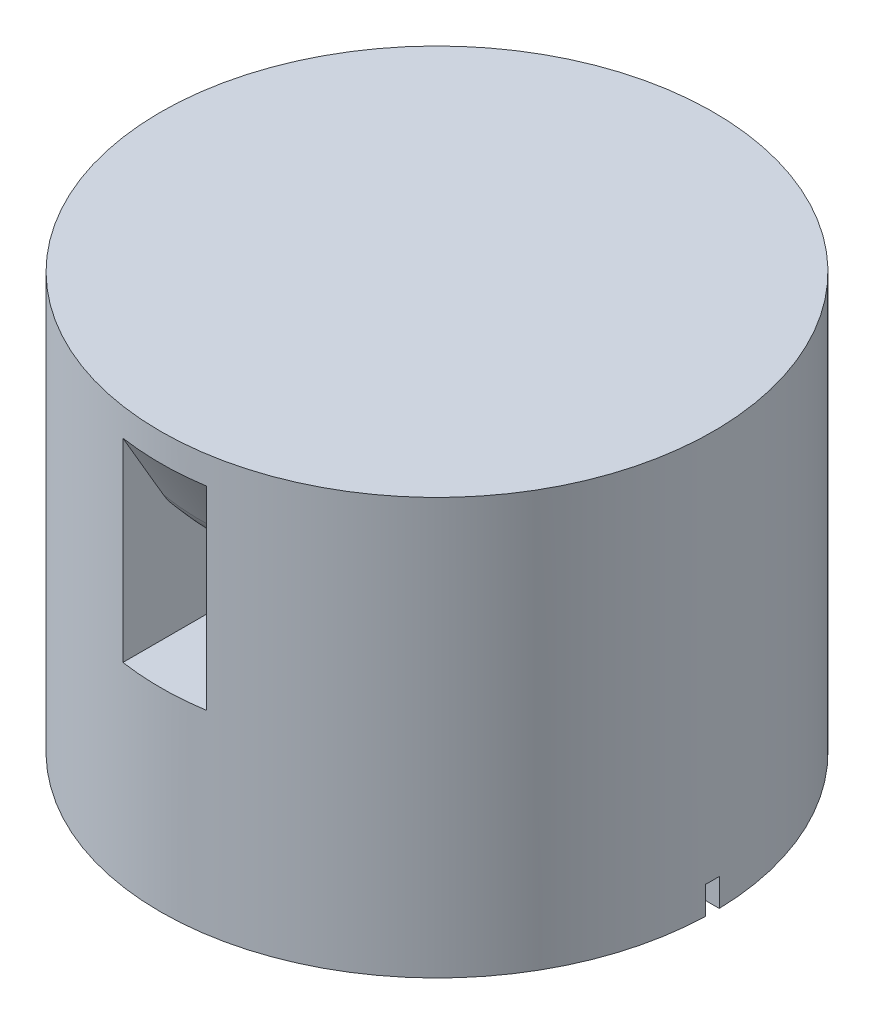
ISO-10303-21;
HEADER;
FILE_DESCRIPTION(('STEP AP214'),'2;1');
FILE_NAME('part.step','',(''),(''),'','','');
FILE_SCHEMA(('AUTOMOTIVE_DESIGN { 1 0 10303 214 1 1 1 1 }'));
ENDSEC;
DATA;
#1=APPLICATION_CONTEXT('core data for automotive mechanical design processes');
#2=APPLICATION_PROTOCOL_DEFINITION('international standard','automotive_design',2000,#1);
#3=PRODUCT_CONTEXT('',#1,'mechanical');
#4=PRODUCT('Part','Part','',(#3));
#5=PRODUCT_RELATED_PRODUCT_CATEGORY('part','',(#4));
#6=PRODUCT_DEFINITION_FORMATION('','',#4);
#7=PRODUCT_DEFINITION_CONTEXT('part definition',#1,'design');
#8=PRODUCT_DEFINITION('design','',#6,#7);
#9=PRODUCT_DEFINITION_SHAPE('','',#8);
#10=(LENGTH_UNIT() NAMED_UNIT(*) SI_UNIT(.MILLI.,.METRE.));
#11=(NAMED_UNIT(*) PLANE_ANGLE_UNIT() SI_UNIT($,.RADIAN.));
#12=(NAMED_UNIT(*) SI_UNIT($,.STERADIAN.) SOLID_ANGLE_UNIT());
#13=UNCERTAINTY_MEASURE_WITH_UNIT(LENGTH_MEASURE(1.E-05),#10,'distance_accuracy_value','');
#14=(GEOMETRIC_REPRESENTATION_CONTEXT(3) GLOBAL_UNCERTAINTY_ASSIGNED_CONTEXT((#13)) GLOBAL_UNIT_ASSIGNED_CONTEXT((#10,
#11,#12)) REPRESENTATION_CONTEXT('',''));
#15=CARTESIAN_POINT('',(0.,0.,0.));
#16=DIRECTION('',(0.,0.,1.));
#17=DIRECTION('',(1.,0.,0.));
#18=AXIS2_PLACEMENT_3D('',#15,#16,#17);
#19=CARTESIAN_POINT('',(-20.5796015309055,4.74630459649336,33.8553121090137));
#20=DIRECTION('',(0.,1.,0.));
#21=DIRECTION('',(0.,0.,1.));
#22=AXIS2_PLACEMENT_3D('',#19,#20,#21);
#23=PLANE('',#22);
#24=CARTESIAN_POINT('',(-20.5796015309055,4.74630459649336,33.8553121090137));
#25=DIRECTION('',(0.,1.,0.));
#26=DIRECTION('',(0.,0.,1.));
#27=AXIS2_PLACEMENT_3D('',#24,#25,#26);
#28=CIRCLE('',#27,6.32716035241819);
#29=CARTESIAN_POINT('',(-14.2538714380474,4.74630459649336,33.720787324972));
#30=VERTEX_POINT('',#29);
#31=CARTESIAN_POINT('',(-26.9053316237637,4.74630459649336,33.720787324972));
#32=VERTEX_POINT('',#31);
#33=EDGE_CURVE('E163',#30,#32,#28,.T.);
#34=ORIENTED_EDGE('',*,*,#33,.F.);
#35=DIRECTION('',(-1.,0.,0.));
#36=VECTOR('',#35,1.);
#37=CARTESIAN_POINT('',(-20.5796015309055,4.74630459649336,33.720787324972));
#38=LINE('',#37,#36);
#39=EDGE_CURVE('E150',#30,#32,#38,.T.);
#40=ORIENTED_EDGE('',*,*,#39,.T.);
#41=EDGE_LOOP('',(#34,#40));
#42=FACE_BOUND('',#41,.T.);
#43=ADVANCED_FACE('F44',(#42),#23,.F.);
#44=CARTESIAN_POINT('',(-20.5796015309055,14.2713045964934,33.8553121090137));
#45=DIRECTION('',(0.,-1.,0.));
#46=DIRECTION('',(0.,0.,-1.));
#47=AXIS2_PLACEMENT_3D('',#44,#45,#46);
#48=CYLINDRICAL_SURFACE('',#47,6.32716035241819);
#49=CARTESIAN_POINT('',(-20.5796015309055,5.38130459649336,33.8553121090137));
#50=DIRECTION('',(0.,-1.,0.));
#51=DIRECTION('',(0.,0.,-1.));
#52=AXIS2_PLACEMENT_3D('',#49,#50,#51);
#53=CIRCLE('',#52,6.32716035241819);
#54=CARTESIAN_POINT('',(-14.2538714380474,5.38130459649336,33.720787324972));
#55=VERTEX_POINT('',#54);
#56=CARTESIAN_POINT('',(-14.2550874629666,5.38130459649336,34.038287324972));
#57=VERTEX_POINT('',#56);
#58=EDGE_CURVE('E12',#55,#57,#53,.T.);
#59=ORIENTED_EDGE('',*,*,#58,.F.);
#60=DIRECTION('',(0.,-1.,0.));
#61=VECTOR('',#60,1.);
#62=CARTESIAN_POINT('',(-14.2538714380474,14.2713045964934,33.720787324972));
#63=LINE('',#62,#61);
#64=EDGE_CURVE('E304',#55,#30,#63,.T.);
#65=ORIENTED_EDGE('',*,*,#64,.T.);
#66=ORIENTED_EDGE('',*,*,#33,.T.);
#67=DIRECTION('',(0.,-1.,0.));
#68=VECTOR('',#67,1.);
#69=CARTESIAN_POINT('',(-26.9053316237637,14.2713045964934,33.720787324972));
#70=LINE('',#69,#68);
#71=CARTESIAN_POINT('',(-26.9053316237637,5.38130459649336,33.720787324972));
#72=VERTEX_POINT('',#71);
#73=EDGE_CURVE('E160',#32,#72,#70,.F.);
#74=ORIENTED_EDGE('',*,*,#73,.T.);
#75=CARTESIAN_POINT('',(-26.9041155988445,5.38130459649336,34.038287324972));
#76=VERTEX_POINT('',#75);
#77=EDGE_CURVE('E48',#76,#72,#53,.T.);
#78=ORIENTED_EDGE('',*,*,#77,.F.);
#79=DIRECTION('',(0.,-1.,0.));
#80=VECTOR('',#79,1.);
#81=CARTESIAN_POINT('',(-26.9041155988445,14.2713045964934,34.038287324972));
#82=LINE('',#81,#80);
#83=CARTESIAN_POINT('',(-26.9041155988445,4.74630459649336,34.038287324972));
#84=VERTEX_POINT('',#83);
#85=EDGE_CURVE('E145',#76,#84,#82,.T.);
#86=ORIENTED_EDGE('',*,*,#85,.T.);
#87=CARTESIAN_POINT('',(-14.2550874629666,4.74630459649336,34.038287324972));
#88=VERTEX_POINT('',#87);
#89=EDGE_CURVE('E158',#84,#88,#28,.T.);
#90=ORIENTED_EDGE('',*,*,#89,.T.);
#91=DIRECTION('',(0.,-1.,0.));
#92=VECTOR('',#91,1.);
#93=CARTESIAN_POINT('',(-14.2550874629666,14.2713045964934,34.038287324972));
#94=LINE('',#93,#92);
#95=EDGE_CURVE('E59',#88,#57,#94,.F.);
#96=ORIENTED_EDGE('',*,*,#95,.T.);
#97=EDGE_LOOP('',(#59,#65,#66,#74,#78,#86,#90,#96));
#98=FACE_BOUND('',#97,.T.);
#99=DIRECTION('',(0.,-1.,0.));
#100=VECTOR('',#99,1.);
#101=CARTESIAN_POINT('',(-21.5092618833237,14.2713045964934,40.113801523749));
#102=LINE('',#101,#100);
#103=CARTESIAN_POINT('',(-21.5092618833237,9.19130459649336,40.113801523749));
#104=VERTEX_POINT('',#103);
#105=CARTESIAN_POINT('',(-21.5092618833237,13.6363045964933,40.113801523749));
#106=VERTEX_POINT('',#105);
#107=EDGE_CURVE('E177',#104,#106,#102,.F.);
#108=ORIENTED_EDGE('',*,*,#107,.T.);
#109=CARTESIAN_POINT('',(-20.5796015309055,13.6363045964933,33.8553121090137));
#110=DIRECTION('',(0.,-1.,0.));
#111=DIRECTION('',(0.,0.,-1.));
#112=AXIS2_PLACEMENT_3D('',#109,#110,#111);
#113=CIRCLE('',#112,6.32716035241819);
#114=CARTESIAN_POINT('',(-19.6042618833237,13.6363045964933,40.1068455766573));
#115=VERTEX_POINT('',#114);
#116=EDGE_CURVE('E182',#106,#115,#113,.F.);
#117=ORIENTED_EDGE('',*,*,#116,.T.);
#118=DIRECTION('',(0.,-1.,0.));
#119=VECTOR('',#118,1.);
#120=CARTESIAN_POINT('',(-19.6042618833237,14.2713045964934,40.1068455766573));
#121=LINE('',#120,#119);
#122=CARTESIAN_POINT('',(-19.6042618833237,9.19130459649336,40.1068455766573));
#123=VERTEX_POINT('',#122);
#124=EDGE_CURVE('E180',#123,#115,#121,.F.);
#125=ORIENTED_EDGE('',*,*,#124,.F.);
#126=CARTESIAN_POINT('',(-20.5796015309055,9.19130459649336,33.8553121090137));
#127=DIRECTION('',(0.,-1.,0.));
#128=DIRECTION('',(0.,0.,-1.));
#129=AXIS2_PLACEMENT_3D('',#126,#127,#128);
#130=CIRCLE('',#129,6.32716035241819);
#131=EDGE_CURVE('E174',#123,#104,#130,.T.);
#132=ORIENTED_EDGE('',*,*,#131,.T.);
#133=EDGE_LOOP('',(#108,#117,#125,#132));
#134=FACE_BOUND('',#133,.T.);
#135=CARTESIAN_POINT('',(-20.5796015309055,14.2713045964934,33.8553121090137));
#136=DIRECTION('',(0.,1.,0.));
#137=DIRECTION('',(0.,0.,1.));
#138=AXIS2_PLACEMENT_3D('',#135,#136,#137);
#139=CIRCLE('',#138,6.32716035241819);
#140=CARTESIAN_POINT('',(-20.5796015309055,14.2713045964934,40.1824724614319));
#141=VERTEX_POINT('',#140);
#142=EDGE_CURVE('E167',#141,#141,#139,.T.);
#143=ORIENTED_EDGE('',*,*,#142,.F.);
#144=EDGE_LOOP('',(#143));
#145=FACE_BOUND('',#144,.T.);
#146=DIRECTION('',(0.,-1.,0.));
#147=VECTOR('',#146,1.);
#148=CARTESIAN_POINT('',(-19.6499411784874,14.2713045964934,27.5968226942784));
#149=LINE('',#148,#147);
#150=CARTESIAN_POINT('',(-19.6499411784874,9.19130459649336,27.5968226942784));
#151=VERTEX_POINT('',#150);
#152=CARTESIAN_POINT('',(-19.6499411784874,13.6363045964934,27.5968226942784));
#153=VERTEX_POINT('',#152);
#154=EDGE_CURVE('E400',#151,#153,#149,.F.);
#155=ORIENTED_EDGE('',*,*,#154,.T.);
#156=CARTESIAN_POINT('',(-20.5796015309055,13.6363045964934,33.8553121090137));
#157=DIRECTION('',(0.,-1.,0.));
#158=DIRECTION('',(0.,0.,-1.));
#159=AXIS2_PLACEMENT_3D('',#156,#157,#158);
#160=CIRCLE('',#159,6.32716035241819);
#161=CARTESIAN_POINT('',(-21.5549411784874,13.6363045964934,27.6037786413701));
#162=VERTEX_POINT('',#161);
#163=EDGE_CURVE('E403',#153,#162,#160,.F.);
#164=ORIENTED_EDGE('',*,*,#163,.T.);
#165=DIRECTION('',(0.,-1.,0.));
#166=VECTOR('',#165,1.);
#167=CARTESIAN_POINT('',(-21.5549411784874,14.2713045964934,27.6037786413701));
#168=LINE('',#167,#166);
#169=CARTESIAN_POINT('',(-21.5549411784874,9.19130459649336,27.6037786413701));
#170=VERTEX_POINT('',#169);
#171=EDGE_CURVE('E405',#170,#162,#168,.F.);
#172=ORIENTED_EDGE('',*,*,#171,.F.);
#173=CARTESIAN_POINT('',(-20.5796015309055,9.19130459649336,33.8553121090137));
#174=DIRECTION('',(0.,-1.,0.));
#175=DIRECTION('',(0.,0.,-1.));
#176=AXIS2_PLACEMENT_3D('',#173,#174,#175);
#177=CIRCLE('',#176,6.32716035241819);
#178=EDGE_CURVE('E240',#170,#151,#177,.T.);
#179=ORIENTED_EDGE('',*,*,#178,.T.);
#180=EDGE_LOOP('',(#155,#164,#172,#179));
#181=FACE_BOUND('',#180,.T.);
#182=ADVANCED_FACE('F156',(#98,#134,#145,#181),#48,.T.);
#183=CARTESIAN_POINT('',(-20.5796015309055,14.2713045964934,33.8553121090137));
#184=DIRECTION('',(0.,1.,0.));
#185=DIRECTION('',(0.,0.,1.));
#186=AXIS2_PLACEMENT_3D('',#183,#184,#185);
#187=PLANE('',#186);
#188=ORIENTED_EDGE('',*,*,#142,.T.);
#189=EDGE_LOOP('',(#188));
#190=FACE_BOUND('',#189,.T.);
#191=ADVANCED_FACE('F385',(#190),#187,.T.);
#192=ORIENTED_EDGE('',*,*,#89,.F.);
#193=DIRECTION('',(1.,0.,0.));
#194=VECTOR('',#193,1.);
#195=CARTESIAN_POINT('',(-20.5796015309055,4.74630459649336,34.038287324972));
#196=LINE('',#195,#194);
#197=EDGE_CURVE('E142',#84,#88,#196,.T.);
#198=ORIENTED_EDGE('',*,*,#197,.T.);
#199=EDGE_LOOP('',(#192,#198));
#200=FACE_BOUND('',#199,.T.);
#201=ADVANCED_FACE('F162',(#200),#23,.F.);
#202=CARTESIAN_POINT('',(-21.5092618833237,11.0963045964934,37.6424724614319));
#203=DIRECTION('',(-1.,0.,0.));
#204=DIRECTION('',(0.,0.,1.));
#205=AXIS2_PLACEMENT_3D('',#202,#203,#204);
#206=PLANE('',#205);
#207=DIRECTION('',(0.,0.,1.));
#208=VECTOR('',#207,1.);
#209=CARTESIAN_POINT('',(-21.5092618833237,9.19130459649336,37.6424724614319));
#210=LINE('',#209,#208);
#211=CARTESIAN_POINT('',(-21.5092618833237,9.19130459649336,37.6424724614319));
#212=VERTEX_POINT('',#211);
#213=EDGE_CURVE('E169',#212,#104,#210,.T.);
#214=ORIENTED_EDGE('',*,*,#213,.F.);
#215=DIRECTION('',(0.,-1.,0.));
#216=VECTOR('',#215,1.);
#217=CARTESIAN_POINT('',(-21.5092618833237,11.0963045964934,37.6424724614319));
#218=LINE('',#217,#216);
#219=CARTESIAN_POINT('',(-21.5092618833237,11.0963045964934,37.6424724614319));
#220=VERTEX_POINT('',#219);
#221=EDGE_CURVE('E325',#220,#212,#218,.T.);
#222=ORIENTED_EDGE('',*,*,#221,.F.);
#223=CARTESIAN_POINT('',(-21.7792183016791,11.0963045964934,37.6424724614319));
#224=CARTESIAN_POINT('',(-22.1096656489326,11.2055818903173,38.5355557012115));
#225=CARTESIAN_POINT('',(-22.3065995956829,12.0347020523457,38.9743169426207));
#226=CARTESIAN_POINT('',(-21.6910444135901,11.0963045964934,37.6424724614319));
#227=CARTESIAN_POINT('',(-21.9990534461454,11.1935737425758,38.5643527731439));
#228=CARTESIAN_POINT('',(-22.1793590067099,12.0385688348577,39.0196133596076));
#229=CARTESIAN_POINT('',(-21.6014394398801,11.0963045964934,37.6424724614319));
#230=CARTESIAN_POINT('',(-21.886522196192,11.1819552256428,38.5898473176062));
#231=CARTESIAN_POINT('',(-22.050204323694,12.0412441540373,39.0594610331579));
#232=CARTESIAN_POINT('',(-21.4202113763615,11.0963045964934,37.6424724614319));
#233=CARTESIAN_POINT('',(-21.6575251765942,11.1604783949205,38.6344113365675));
#234=CARTESIAN_POINT('',(-21.7891633219495,12.0450338324148,39.1284849162753));
#235=CARTESIAN_POINT('',(-21.3285900252199,11.0963045964934,37.6424724614319));
#236=CARTESIAN_POINT('',(-21.5412078754435,11.1506456276036,38.6534126681317));
#237=CARTESIAN_POINT('',(-21.6572793620387,12.0461494867324,39.1576699650134));
#238=CARTESIAN_POINT('',(-21.1434586554428,11.0963045964934,37.6424724614319));
#239=CARTESIAN_POINT('',(-21.3049440221206,11.1338176084532,38.6849700903826));
#240=CARTESIAN_POINT('',(-21.3908477528837,12.0476500752033,39.205816113611));
#241=CARTESIAN_POINT('',(-21.0499405034984,11.0963045964934,37.6424724614319));
#242=CARTESIAN_POINT('',(-21.1851866686426,11.1268695570108,38.6974254221616));
#243=CARTESIAN_POINT('',(-21.2562887328968,12.0480304894575,39.224713463007));
#244=CARTESIAN_POINT('',(-20.8621433399089,11.0963045964934,37.6424724614319));
#245=CARTESIAN_POINT('',(-20.9437979901111,11.1165952650812,38.7155977642217));
#246=CARTESIAN_POINT('',(-20.9860911935067,12.0484906136459,39.2521649277144));
#247=CARTESIAN_POINT('',(-20.7678641350637,11.0963045964934,37.6424724614319));
#248=CARTESIAN_POINT('',(-20.8224067539581,11.1132905186426,38.7212757452005));
#249=CARTESIAN_POINT('',(-20.8504524001225,12.0485702446535,39.2607163278115));
#250=CARTESIAN_POINT('',(-20.5766240164166,11.0963045964934,37.6424724614319));
#251=CARTESIAN_POINT('',(-20.5757344082746,11.1106227111804,38.7258724349378));
#252=CARTESIAN_POINT('',(-20.5753178205361,12.0486396786928,39.2676277323927));
#253=CARTESIAN_POINT('',(-20.4796582418544,11.0963045964934,37.6424724614319));
#254=CARTESIAN_POINT('',(-20.4507136155471,11.1113723589803,38.7245978359848));
#255=CARTESIAN_POINT('',(-20.4358150719852,12.0486270454861,39.2657116736717));
#256=CARTESIAN_POINT('',(-20.2861277357106,11.0963045964934,37.6424724614319));
#257=CARTESIAN_POINT('',(-20.2012868601358,11.1170004362871,38.7148438018607));
#258=CARTESIAN_POINT('',(-20.1573824855133,12.0484572168905,39.2510300401489));
#259=CARTESIAN_POINT('',(-20.1895629969601,11.0963045964934,37.6424724614319));
#260=CARTESIAN_POINT('',(-20.0771559148737,11.121866357438,38.7063861198594));
#261=CARTESIAN_POINT('',(-20.0184526373514,12.048300024097,39.2382646601359));
#262=CARTESIAN_POINT('',(-19.9978225986984,11.0963045964934,37.6424724614319));
#263=CARTESIAN_POINT('',(-19.8312875572798,11.1352031566803,38.6823538532164));
#264=CARTESIAN_POINT('',(-19.7425643050365,12.0475205735769,39.2018434516658));
#265=CARTESIAN_POINT('',(-19.9026429637207,11.0963045964934,37.6424724614319));
#266=CARTESIAN_POINT('',(-19.7097892591353,11.1436329663817,38.6668579433805));
#267=CARTESIAN_POINT('',(-19.6056002082702,12.0469001517801,39.1782307564637));
#268=CARTESIAN_POINT('',(-19.7140351733358,11.0963045964934,37.6424724614319));
#269=CARTESIAN_POINT('',(-19.4700184579071,11.1631663420208,38.6288709910321));
#270=CARTESIAN_POINT('',(-19.3340950323966,12.0445738772183,39.1199443389813));
#271=CARTESIAN_POINT('',(-19.6206065820495,11.0963045964934,37.6424724614319));
#272=CARTESIAN_POINT('',(-19.3519409897519,11.1742371811836,38.606453887727));
#273=CARTESIAN_POINT('',(-19.1995533506257,12.0428682983724,39.0852734091586));
#274=CARTESIAN_POINT('',(-19.411159264568,11.0963045964934,37.6424724614319));
#275=CARTESIAN_POINT('',(-19.0888132022642,11.2009451766221,38.547749558731));
#276=CARTESIAN_POINT('',(-18.897668805336,12.0366833953803,38.9935351005625));
#277=CARTESIAN_POINT('',(-19.2959130733997,11.0963045964934,37.6424724614319));
#278=CARTESIAN_POINT('',(-18.9450911128933,11.2169890660086,38.5094330165098));
#279=CARTESIAN_POINT('',(-18.7313648625663,12.0315754824632,38.9329403782083));
#280=CARTESIAN_POINT('',(-19.1280022690643,11.0963045964934,37.6424724614319));
#281=CARTESIAN_POINT('',(-18.7364028749111,11.2400168878399,38.4437712779382));
#282=CARTESIAN_POINT('',(-18.4883281506141,12.0191490815576,38.8276561045493));
#283=CARTESIAN_POINT('',(-19.0727686109847,11.0963045964934,37.6424724614319));
#284=CARTESIAN_POINT('',(-18.6681665308301,11.247500676293,38.4205905929404));
#285=CARTESIAN_POINT('',(-18.4082549308855,12.0142003478938,38.7900863347003));
#286=CARTESIAN_POINT('',(-18.9644164100313,11.0963045964934,37.6424724614319));
#287=CARTESIAN_POINT('',(-18.5346528989852,11.2614827664091,38.371676289448));
#288=CARTESIAN_POINT('',(-18.2507866394959,12.0021267968925,38.7100324155509));
#289=CARTESIAN_POINT('',(-18.9113011876967,11.0963045964934,37.6424724614319));
#290=CARTESIAN_POINT('',(-18.4693713378686,11.267984196171,38.345955535897));
#291=CARTESIAN_POINT('',(-18.1733957954075,11.9949987042165,38.6675409295658));
#292=CARTESIAN_POINT('',(-18.8595230297982,11.0963045964934,37.6424724614319));
#293=CARTESIAN_POINT('',(-18.4056422219152,11.2737056526786,38.3189505395719));
#294=CARTESIAN_POINT('',(-18.0976837108105,11.9864962217538,38.6225830028886));
#295=(BOUNDED_SURFACE() B_SPLINE_SURFACE(3,2,((#223,#224,#225),(#226,#227,#228),(#229,#230,
#231),(#232,#233,#234),(#235,#236,#237),(#238,#239,#240),(#241,#242,#243),(#244,#245,#246),
(#247,#248,#249),(#250,#251,#252),(#253,#254,#255),(#256,#257,#258),(#259,#260,#261),(#262,#263,
#264),(#265,#266,#267),(#268,#269,#270),(#271,#272,#273),(#274,#275,#276),(#277,#278,#279),
(#280,#281,#282),(#283,#284,#285),(#286,#287,#288),(#289,#290,#291),(#292,#293,#294)),
.UNSPECIFIED.,.F.,.F.,.F.) B_SPLINE_SURFACE_WITH_KNOTS((4,2,2,2,2,2,2,2,2,2,2,4),(3,3),(0.,
0.281563117970215,0.562892291454136,0.845945506918825,1.12907299140473,1.41970298187176,
1.71032775447867,1.99980675886128,2.28921272096391,2.65738659219709,2.84210369825749,
3.02709979003919),(0.,1.),
.UNSPECIFIED.) GEOMETRIC_REPRESENTATION_ITEM() RATIONAL_B_SPLINE_SURFACE(((1.,0.89329772510079,
1.),(1.,0.889939767838788,1.),(1.,0.886841767415508,1.),(1.,0.881305683164464,1.),(1.,
0.878867053165514,1.),(1.,0.874771163782259,1.),(1.,0.873118784377259,1.),(1.,0.870698396390802,
1.),(1.,0.869930619969067,1.),(1.,0.86931120055151,1.),(1.,0.86948437300409,1.),(1.,
0.870795378872498,1.),(1.,0.871933194969115,1.),(1.,0.875107687459945,1.),(1.,0.877140802474305,
1.),(1.,0.881993547897769,1.),(1.,0.88481297972132,1.),(1.,0.891938121342945,1.),(1.,
0.896439497702486,1.),(1.,0.903610467262528,1.),(1.,0.906075164070434,1.),(1.,0.911065752874049,
1.),(1.,0.913591731673037,1.),(1.,0.916106119327105,1.))) REPRESENTATION_ITEM('') SURFACE());
#296=CARTESIAN_POINT('',(-21.5092618833237,11.0963045964934,37.6424724614319));
#297=CARTESIAN_POINT('',(-21.5092618833237,11.1006142928998,37.6983632270615));
#298=CARTESIAN_POINT('',(-21.5092618833237,11.1072138551146,37.7540540925704));
#299=CARTESIAN_POINT('',(-21.5092618833237,11.1249975053248,37.8647076033461));
#300=CARTESIAN_POINT('',(-21.5092618833237,11.1361823504062,37.9196701268069));
#301=CARTESIAN_POINT('',(-21.5092618833237,11.1766018867574,38.0828766825527));
#302=CARTESIAN_POINT('',(-21.5092618833237,11.2127069608871,38.1895104111569));
#303=CARTESIAN_POINT('',(-21.5092618833237,11.3025994231927,38.3952204187264));
#304=CARTESIAN_POINT('',(-21.5092618833237,11.3564180101921,38.4942829804958));
#305=CARTESIAN_POINT('',(-21.5092618833237,11.4803094978598,38.6815547366382));
#306=CARTESIAN_POINT('',(-21.5092618833237,11.5503625853278,38.7697769617435));
#307=CARTESIAN_POINT('',(-21.5092618833237,11.6891603092216,38.9161612929928));
#308=CARTESIAN_POINT('',(-21.5092618833237,11.7553187470333,38.9767973590451));
#309=CARTESIAN_POINT('',(-21.5092618833237,11.8955414562874,39.0882686257307));
#310=CARTESIAN_POINT('',(-21.5092618833237,11.9696138388075,39.1390936182667));
#311=CARTESIAN_POINT('',(-21.5092618833237,12.0469819987753,39.1843945774543));
#312=B_SPLINE_CURVE_WITH_KNOTS('',3,(#296,#297,#298,#299,#300,#301,#302,#303,#304,#305,#306,
#307,#308,#309,#310,#311),.UNSPECIFIED.,.F.,.F.,(4,2,2,2,2,2,2,4),(0.,0.168074204249762,
0.336176170776162,0.672169998943412,1.00875880876284,1.34493897622601,1.61330971868368,
1.88195820449471),.UNSPECIFIED.);
#313=CARTESIAN_POINT('',(-21.5092618833237,12.0469819987753,39.1843945774543));
#314=VERTEX_POINT('',#313);
#315=EDGE_CURVE('E356',#220,#314,#312,.T.);
#316=ORIENTED_EDGE('',*,*,#315,.T.);
#317=CARTESIAN_POINT('',(-21.5092618833237,11.0963045964934,38.6262706506174));
#318=CARTESIAN_POINT('',(-21.5092618833237,11.3077357914957,38.7506332767424));
#319=CARTESIAN_POINT('',(-21.5092618833237,11.5192418765568,38.8748684707272));
#320=CARTESIAN_POINT('',(-21.5092618833237,11.9423786269782,39.1231262027246));
#321=CARTESIAN_POINT('',(-21.5092618833237,12.1540092922524,39.2471487408839));
#322=CARTESIAN_POINT('',(-21.5092618833237,12.5773702426909,39.4950235103418));
#323=CARTESIAN_POINT('',(-21.5092618833237,12.7891005278305,39.6188757416825));
#324=CARTESIAN_POINT('',(-21.5092618833237,13.2126443254902,39.866438155348));
#325=CARTESIAN_POINT('',(-21.5092618833237,13.4244578380675,39.9901483375751));
#326=CARTESIAN_POINT('',(-21.5092618833237,13.6363045964933,40.113801523749));
#327=B_SPLINE_CURVE_WITH_KNOTS('',3,(#317,#318,#319,#320,#321,#322,#323,#324,#325,#326),
.UNSPECIFIED.,.F.,.F.,(4,2,2,2,4),(0.,0.735882282467495,1.47176405722892,2.20764564981234,
2.94352774781471),.UNSPECIFIED.);
#328=EDGE_CURVE('E185',#314,#106,#327,.T.);
#329=ORIENTED_EDGE('',*,*,#328,.T.);
#330=ORIENTED_EDGE('',*,*,#107,.F.);
#331=EDGE_LOOP('',(#214,#222,#316,#329,#330));
#332=FACE_BOUND('',#331,.T.);
#333=ADVANCED_FACE('F200',(#332),#206,.F.);
#334=CARTESIAN_POINT('',(-19.6042618833237,11.0963045964934,37.6424724614319));
#335=DIRECTION('',(-1.,0.,0.));
#336=DIRECTION('',(0.,0.,1.));
#337=AXIS2_PLACEMENT_3D('',#334,#335,#336);
#338=PLANE('',#337);
#339=ORIENTED_EDGE('',*,*,#124,.T.);
#340=CARTESIAN_POINT('',(-19.6042618833237,13.6363045964933,40.1068455766573));
#341=CARTESIAN_POINT('',(-19.6042618833237,13.4244387470204,39.9830435011454));
#342=CARTESIAN_POINT('',(-19.6042618833237,13.2126096324273,39.8591785136663));
#343=CARTESIAN_POINT('',(-19.6042618833237,12.7890434428268,39.6112916860172));
#344=CARTESIAN_POINT('',(-19.6042618833237,12.5773063677423,39.4872698459788));
#345=CARTESIAN_POINT('',(-19.6042618833237,12.1539424077337,39.2390380394817));
#346=CARTESIAN_POINT('',(-19.6042618833237,11.9423155228429,39.1148280729662));
#347=CARTESIAN_POINT('',(-19.6042618833237,11.5191996435106,38.8661731150644));
#348=CARTESIAN_POINT('',(-19.6042618833237,11.3077106491853,38.7417281234803));
#349=CARTESIAN_POINT('',(-19.6042618833237,11.0963045964934,38.617142255965));
#350=B_SPLINE_CURVE_WITH_KNOTS('',3,(#340,#341,#342,#343,#344,#345,#346,#347,#348,#349),
.UNSPECIFIED.,.F.,.F.,(4,2,2,2,4),(0.,0.736156818349456,1.47231301961745,2.20846944344556,
2.94462648716325),.UNSPECIFIED.);
#351=CARTESIAN_POINT('',(-19.6042618833237,12.0467177262526,39.1760686494312));
#352=VERTEX_POINT('',#351);
#353=EDGE_CURVE('E193',#115,#352,#350,.T.);
#354=ORIENTED_EDGE('',*,*,#353,.T.);
#355=CARTESIAN_POINT('',(-19.6042618833237,12.0467177262526,39.1760686494312));
#356=CARTESIAN_POINT('',(-19.6042618833237,12.0002021353895,39.1487648485426));
#357=CARTESIAN_POINT('',(-19.6042618833237,11.9548761716458,39.1194877728033));
#358=CARTESIAN_POINT('',(-19.6042618833237,11.8668777821475,39.0571971917487));
#359=CARTESIAN_POINT('',(-19.6042618833237,11.8242050000177,39.0241841899301));
#360=CARTESIAN_POINT('',(-19.6042618833237,11.7008541859556,38.9200932985967));
#361=CARTESIAN_POINT('',(-19.6042618833237,11.6245072573757,38.8437652140681));
#362=CARTESIAN_POINT('',(-19.6042618833237,11.4856150807317,38.6794832984551));
#363=CARTESIAN_POINT('',(-19.6042618833237,11.4230742157968,38.5915257894078));
#364=CARTESIAN_POINT('',(-19.6042618833237,11.3132719844937,38.4064796708043));
#365=CARTESIAN_POINT('',(-19.6042618833237,11.2660186256031,38.3093863102167));
#366=CARTESIAN_POINT('',(-19.6042618833237,11.191601503778,38.1184473172889));
#367=CARTESIAN_POINT('',(-19.6042618833237,11.1629475092236,38.0251806986278));
#368=CARTESIAN_POINT('',(-19.6042618833237,11.1302529255774,37.8830234943712));
#369=CARTESIAN_POINT('',(-19.6042618833237,11.1210692378785,37.835262823098));
#370=CARTESIAN_POINT('',(-19.6042618833237,11.1061231336941,37.7392109741832));
#371=CARTESIAN_POINT('',(-19.6042618833237,11.1003605535692,37.6909198220282));
#372=CARTESIAN_POINT('',(-19.6042618833237,11.0963045964934,37.6424724614319));
#373=B_SPLINE_CURVE_WITH_KNOTS('',3,(#355,#356,#357,#358,#359,#360,#361,#362,#363,#364,#365,
#366,#367,#368,#369,#370,#371,#372),.UNSPECIFIED.,.F.,.F.,(4,2,2,2,2,2,2,2,4),(0.,
0.161708880496266,0.323395993127052,0.645613715189041,0.967933587816608,1.29042201678779,
1.58203584268701,1.72783514402635,1.87362747089805),.UNSPECIFIED.);
#374=CARTESIAN_POINT('',(-19.6042618833237,11.0963045964934,37.6424724614319));
#375=VERTEX_POINT('',#374);
#376=EDGE_CURVE('E358',#352,#375,#373,.T.);
#377=ORIENTED_EDGE('',*,*,#376,.T.);
#378=DIRECTION('',(0.,-1.,0.));
#379=VECTOR('',#378,1.);
#380=CARTESIAN_POINT('',(-19.6042618833237,11.0963045964934,37.6424724614319));
#381=LINE('',#380,#379);
#382=CARTESIAN_POINT('',(-19.6042618833237,9.19130459649336,37.6424724614319));
#383=VERTEX_POINT('',#382);
#384=EDGE_CURVE('E333',#375,#383,#381,.T.);
#385=ORIENTED_EDGE('',*,*,#384,.T.);
#386=DIRECTION('',(0.,0.,1.));
#387=VECTOR('',#386,1.);
#388=CARTESIAN_POINT('',(-19.6042618833237,9.19130459649336,37.6424724614319));
#389=LINE('',#388,#387);
#390=EDGE_CURVE('E164',#383,#123,#389,.T.);
#391=ORIENTED_EDGE('',*,*,#390,.T.);
#392=EDGE_LOOP('',(#339,#354,#377,#385,#391));
#393=FACE_BOUND('',#392,.T.);
#394=ADVANCED_FACE('F351',(#393),#338,.T.);
#395=CARTESIAN_POINT('',(-21.5092618833237,9.19130459649336,37.6424724614319));
#396=DIRECTION('',(0.,-1.,0.));
#397=DIRECTION('',(0.,0.,-1.));
#398=AXIS2_PLACEMENT_3D('',#395,#396,#397);
#399=PLANE('',#398);
#400=ORIENTED_EDGE('',*,*,#390,.F.);
#401=DIRECTION('',(1.,0.,0.));
#402=VECTOR('',#401,1.);
#403=CARTESIAN_POINT('',(-21.5092618833237,9.19130459649336,37.6424724614319));
#404=LINE('',#403,#402);
#405=EDGE_CURVE('E330',#212,#383,#404,.T.);
#406=ORIENTED_EDGE('',*,*,#405,.F.);
#407=ORIENTED_EDGE('',*,*,#213,.T.);
#408=ORIENTED_EDGE('',*,*,#131,.F.);
#409=EDGE_LOOP('',(#400,#406,#407,#408));
#410=FACE_BOUND('',#409,.T.);
#411=ADVANCED_FACE('F341',(#410),#399,.F.);
#412=CARTESIAN_POINT('',(-10.2898007654528,4.74630459649336,37.6424724614319));
#413=DIRECTION('',(0.,0.,1.));
#414=DIRECTION('',(1.,0.,0.));
#415=AXIS2_PLACEMENT_3D('',#412,#413,#414);
#416=PLANE('',#415);
#417=ORIENTED_EDGE('',*,*,#221,.T.);
#418=ORIENTED_EDGE('',*,*,#405,.T.);
#419=ORIENTED_EDGE('',*,*,#384,.F.);
#420=DIRECTION('',(1.,0.,0.));
#421=VECTOR('',#420,1.);
#422=CARTESIAN_POINT('',(-21.5092618833237,11.0963045964934,37.6424724614319));
#423=LINE('',#422,#421);
#424=EDGE_CURVE('E335',#220,#375,#423,.T.);
#425=ORIENTED_EDGE('',*,*,#424,.F.);
#426=EDGE_LOOP('',(#417,#418,#419,#425));
#427=FACE_BOUND('',#426,.T.);
#428=ADVANCED_FACE('F210',(#427),#416,.T.);
#429=CARTESIAN_POINT('',(-20.5796015309055,11.0963045964934,33.8553121090137));
#430=DIRECTION('',(0.,1.,0.));
#431=DIRECTION('',(0.,0.,1.));
#432=AXIS2_PLACEMENT_3D('',#429,#430,#431);
#433=CONICAL_SURFACE('',#432,4.86069066867656,0.523598775598297);
#434=ORIENTED_EDGE('',*,*,#328,.F.);
#435=CARTESIAN_POINT('',(-22.3065995956829,12.0347020523457,38.9743169426207));
#436=CARTESIAN_POINT('',(-22.1793590067099,12.0385688348577,39.0196133596076));
#437=CARTESIAN_POINT('',(-22.050204323694,12.0412441540373,39.0594610331579));
#438=CARTESIAN_POINT('',(-21.7891633219495,12.0450338324148,39.1284849162753));
#439=CARTESIAN_POINT('',(-21.6572793620387,12.0461494867324,39.1576699650134));
#440=CARTESIAN_POINT('',(-21.3908477528837,12.0476500752033,39.205816113611));
#441=CARTESIAN_POINT('',(-21.2562887328968,12.0480304894575,39.224713463007));
#442=CARTESIAN_POINT('',(-20.9860911935067,12.0484906136459,39.2521649277144));
#443=CARTESIAN_POINT('',(-20.8504524001225,12.0485702446535,39.2607163278115));
#444=CARTESIAN_POINT('',(-20.5753178205361,12.0486396786928,39.2676277323927));
#445=CARTESIAN_POINT('',(-20.4358150719852,12.0486270454861,39.2657116736717));
#446=CARTESIAN_POINT('',(-20.1573824855133,12.0484572168905,39.2510300401489));
#447=CARTESIAN_POINT('',(-20.0184526373514,12.048300024097,39.2382646601359));
#448=CARTESIAN_POINT('',(-19.7425643050365,12.0475205735769,39.2018434516658));
#449=CARTESIAN_POINT('',(-19.6056002082702,12.0469001517801,39.1782307564637));
#450=CARTESIAN_POINT('',(-19.3340950323966,12.0445738772183,39.1199443389813));
#451=CARTESIAN_POINT('',(-19.1995533506257,12.0428682983724,39.0852734091586));
#452=CARTESIAN_POINT('',(-18.897668805336,12.0366833953803,38.9935351005625));
#453=CARTESIAN_POINT('',(-18.7313648625663,12.0315754824632,38.9329403782083));
#454=CARTESIAN_POINT('',(-18.4883281506141,12.0191490815576,38.8276561045493));
#455=CARTESIAN_POINT('',(-18.4082549308855,12.0142003478938,38.7900863347004));
#456=CARTESIAN_POINT('',(-18.2507866394959,12.0021267968925,38.7100324155509));
#457=CARTESIAN_POINT('',(-18.1733957954075,11.9949987042165,38.6675409295658));
#458=CARTESIAN_POINT('',(-18.0976837108105,11.9864962217538,38.6225830028886));
#459=B_SPLINE_CURVE_WITH_KNOTS('',3,(#435,#436,#437,#438,#439,#440,#441,#442,#443,#444,#445,
#446,#447,#448,#449,#450,#451,#452,#453,#454,#455,#456,#457,#458),.UNSPECIFIED.,.F.,.F.,(4,2,2,
2,2,2,2,2,2,2,2,4),(0.,0.281563117970215,0.562892291454136,0.845945506918825,1.12907299140473,
1.41970298187176,1.71032775447867,1.99980675886128,2.28921272096391,2.65738659219709,
2.84210369825749,3.02709979003919),.UNSPECIFIED.);
#460=EDGE_CURVE('E359',#314,#352,#459,.T.);
#461=ORIENTED_EDGE('',*,*,#460,.T.);
#462=ORIENTED_EDGE('',*,*,#353,.F.);
#463=ORIENTED_EDGE('',*,*,#116,.F.);
#464=EDGE_LOOP('',(#434,#461,#462,#463));
#465=FACE_BOUND('',#464,.T.);
#466=ADVANCED_FACE('F204',(#465),#433,.T.);
#467=ORIENTED_EDGE('',*,*,#376,.F.);
#468=ORIENTED_EDGE('',*,*,#460,.F.);
#469=ORIENTED_EDGE('',*,*,#315,.F.);
#470=ORIENTED_EDGE('',*,*,#424,.T.);
#471=EDGE_LOOP('',(#467,#468,#469,#470));
#472=FACE_BOUND('',#471,.T.);
#473=ADVANCED_FACE('F209',(#472),#295,.T.);
#474=CARTESIAN_POINT('',(-19.6499411784874,11.0963045964934,30.0681517565955));
#475=DIRECTION('',(1.,0.,0.));
#476=DIRECTION('',(0.,0.,-1.));
#477=AXIS2_PLACEMENT_3D('',#474,#475,#476);
#478=PLANE('',#477);
#479=DIRECTION('',(0.,0.,-1.));
#480=VECTOR('',#479,1.);
#481=CARTESIAN_POINT('',(-19.6499411784874,9.19130459649336,30.0681517565955));
#482=LINE('',#481,#480);
#483=CARTESIAN_POINT('',(-19.6499411784874,9.19130459649336,30.0681517565955));
#484=VERTEX_POINT('',#483);
#485=EDGE_CURVE('E321',#484,#151,#482,.T.);
#486=ORIENTED_EDGE('',*,*,#485,.F.);
#487=DIRECTION('',(0.,-1.,0.));
#488=VECTOR('',#487,1.);
#489=CARTESIAN_POINT('',(-19.6499411784874,11.0963045964934,30.0681517565955));
#490=LINE('',#489,#488);
#491=CARTESIAN_POINT('',(-19.6499411784874,11.0963045964934,30.0681517565955));
#492=VERTEX_POINT('',#491);
#493=EDGE_CURVE('E307',#492,#484,#490,.T.);
#494=ORIENTED_EDGE('',*,*,#493,.F.);
#495=CARTESIAN_POINT('',(-19.379984760132,11.0963045964934,30.0681517565955));
#496=CARTESIAN_POINT('',(-19.0495374128785,11.2055818903173,29.175068516816));
#497=CARTESIAN_POINT('',(-18.8526034661282,12.0347020523457,28.7363072754068));
#498=CARTESIAN_POINT('',(-19.468158648221,11.0963045964934,30.0681517565955));
#499=CARTESIAN_POINT('',(-19.1601496156657,11.1935737425758,29.1462714448835));
#500=CARTESIAN_POINT('',(-18.9798440551012,12.0385688348577,28.6910108584199));
#501=CARTESIAN_POINT('',(-19.557763621931,11.0963045964934,30.0681517565955));
#502=CARTESIAN_POINT('',(-19.2726808656192,11.1819552256428,29.1207769004213));
#503=CARTESIAN_POINT('',(-19.1089987381171,12.0412441540373,28.6511631848695));
#504=CARTESIAN_POINT('',(-19.7389916854496,11.0963045964934,30.0681517565955));
#505=CARTESIAN_POINT('',(-19.5016778852169,11.1604783949205,29.0762128814599));
#506=CARTESIAN_POINT('',(-19.3700397398616,12.0450338324148,28.5821393017522));
#507=CARTESIAN_POINT('',(-19.8306130365912,11.0963045964934,30.0681517565955));
#508=CARTESIAN_POINT('',(-19.6179951863676,11.1506456276036,29.0572115498958));
#509=CARTESIAN_POINT('',(-19.5019236997724,12.0461494867324,28.552954253014));
#510=CARTESIAN_POINT('',(-20.0157444063683,11.0963045964934,30.0681517565955));
#511=CARTESIAN_POINT('',(-19.8542590396905,11.1338176084532,29.0256541276449));
#512=CARTESIAN_POINT('',(-19.7683553089274,12.0476500752033,28.5048081044164));
#513=CARTESIAN_POINT('',(-20.1092625583127,11.0963045964934,30.0681517565955));
#514=CARTESIAN_POINT('',(-19.9740163931685,11.1268695570109,29.0131987958659));
#515=CARTESIAN_POINT('',(-19.9029143289143,12.0480304894575,28.4859107550205));
#516=CARTESIAN_POINT('',(-20.2970597219022,11.0963045964934,30.0681517565955));
#517=CARTESIAN_POINT('',(-20.2154050717,11.1165952650812,28.9950264538058));
#518=CARTESIAN_POINT('',(-20.1731118683044,12.0484906136459,28.4584592903131));
#519=CARTESIAN_POINT('',(-20.3913389267473,11.0963045964934,30.0681517565955));
#520=CARTESIAN_POINT('',(-20.336796307853,11.1132905186426,28.9893484728269));
#521=CARTESIAN_POINT('',(-20.3087506616886,12.0485702446535,28.4499078902159));
#522=CARTESIAN_POINT('',(-20.5825790453945,11.0963045964934,30.0681517565955));
#523=CARTESIAN_POINT('',(-20.5834686535365,11.1106227111804,28.9847517830896));
#524=CARTESIAN_POINT('',(-20.583885241275,12.0486396786928,28.4429964856347));
#525=CARTESIAN_POINT('',(-20.6795448199567,11.0963045964934,30.0681517565955));
#526=CARTESIAN_POINT('',(-20.7084894462639,11.1113723589803,28.9860263820427));
#527=CARTESIAN_POINT('',(-20.7233879898258,12.0486270454861,28.4449125443558));
#528=CARTESIAN_POINT('',(-20.8730753261005,11.0963045964934,30.0681517565955));
#529=CARTESIAN_POINT('',(-20.9579162016753,11.1170004362871,28.9957804161668));
#530=CARTESIAN_POINT('',(-21.0018205762978,12.0484572168905,28.4595941778785));
#531=CARTESIAN_POINT('',(-20.969640064851,11.0963045964934,30.0681517565955));
#532=CARTESIAN_POINT('',(-21.0820471469373,11.121866357438,29.004238098168));
#533=CARTESIAN_POINT('',(-21.1407504244597,12.048300024097,28.4723595578915));
#534=CARTESIAN_POINT('',(-21.1613804631127,11.0963045964934,30.0681517565955));
#535=CARTESIAN_POINT('',(-21.3279155045313,11.1352031566803,29.028270364811));
#536=CARTESIAN_POINT('',(-21.4166387567746,12.0475205735769,28.5087807663616));
#537=CARTESIAN_POINT('',(-21.2565600980904,11.0963045964934,30.0681517565955));
#538=CARTESIAN_POINT('',(-21.4494138026758,11.1436329663817,29.043766274647));
#539=CARTESIAN_POINT('',(-21.5536028535409,12.0469001517801,28.5323934615637));
#540=CARTESIAN_POINT('',(-21.4451678884753,11.0963045964934,30.0681517565955));
#541=CARTESIAN_POINT('',(-21.689184603904,11.1631663420208,29.0817532269954));
#542=CARTESIAN_POINT('',(-21.8251080294145,12.0445738772183,28.5906798790461));
#543=CARTESIAN_POINT('',(-21.5385964797616,11.0963045964934,30.0681517565955));
#544=CARTESIAN_POINT('',(-21.8072620720592,11.1742371811836,29.1041703303004));
#545=CARTESIAN_POINT('',(-21.9596497111854,12.0428682983724,28.6253508088689));
#546=CARTESIAN_POINT('',(-21.7480437972431,11.0963045964934,30.0681517565955));
#547=CARTESIAN_POINT('',(-22.0703898595469,11.2009451766221,29.1628746592964));
#548=CARTESIAN_POINT('',(-22.2615342564751,12.0366833953803,28.7170891174649));
#549=CARTESIAN_POINT('',(-21.8632899884114,11.0963045964934,30.0681517565955));
#550=CARTESIAN_POINT('',(-22.2141119489177,11.2169890660086,29.2011912015177));
#551=CARTESIAN_POINT('',(-22.4278381992447,12.0315754824632,28.7776838398192));
#552=CARTESIAN_POINT('',(-22.0312007927468,11.0963045964934,30.0681517565955));
#553=CARTESIAN_POINT('',(-22.4228001869,11.2400168878399,29.2668529400892));
#554=CARTESIAN_POINT('',(-22.670874911197,12.0191490815576,28.8829681134781));
#555=CARTESIAN_POINT('',(-22.0864344508264,11.0963045964934,30.0681517565955));
#556=CARTESIAN_POINT('',(-22.491036530981,11.247500676293,29.2900336250871));
#557=CARTESIAN_POINT('',(-22.7509481309255,12.0142003478938,28.9205378833271));
#558=CARTESIAN_POINT('',(-22.1947866517797,11.0963045964934,30.0681517565955));
#559=CARTESIAN_POINT('',(-22.6245501628259,11.2614827664092,29.3389479285795));
#560=CARTESIAN_POINT('',(-22.9084164223152,12.0021267968925,29.0005918024765));
#561=CARTESIAN_POINT('',(-22.2479018741144,11.0963045964934,30.0681517565955));
#562=CARTESIAN_POINT('',(-22.6898317239425,11.267984196171,29.3646686821304));
#563=CARTESIAN_POINT('',(-22.9858072664036,11.9949987042165,29.0430832884617));
#564=CARTESIAN_POINT('',(-22.2996800320129,11.0963045964934,30.0681517565955));
#565=CARTESIAN_POINT('',(-22.7535608398959,11.2737056526786,29.3916736784555));
#566=CARTESIAN_POINT('',(-23.0615193510006,11.9864962217538,29.0880412151388));
#567=(BOUNDED_SURFACE() B_SPLINE_SURFACE(3,2,((#495,#496,#497),(#498,#499,#500),(#501,#502,
#503),(#504,#505,#506),(#507,#508,#509),(#510,#511,#512),(#513,#514,#515),(#516,#517,#518),
(#519,#520,#521),(#522,#523,#524),(#525,#526,#527),(#528,#529,#530),(#531,#532,#533),(#534,#535,
#536),(#537,#538,#539),(#540,#541,#542),(#543,#544,#545),(#546,#547,#548),(#549,#550,#551),
(#552,#553,#554),(#555,#556,#557),(#558,#559,#560),(#561,#562,#563),(#564,#565,#566)),
.UNSPECIFIED.,.F.,.F.,.F.) B_SPLINE_SURFACE_WITH_KNOTS((4,2,2,2,2,2,2,2,2,2,2,4),(3,3),(0.,
0.281563117970215,0.562892291454139,0.845945506918825,1.12907299140473,1.41970298187175,
1.71032775447865,1.99980675886127,2.2892127209639,2.65738659219707,2.84210369825747,
3.02709979003917),(0.,1.),
.UNSPECIFIED.) GEOMETRIC_REPRESENTATION_ITEM() RATIONAL_B_SPLINE_SURFACE(((1.,0.893297725100791,
1.),(1.,0.88993976783879,1.),(1.,0.88684176741551,1.),(1.,0.881305683164467,1.),(1.,
0.878867053165518,1.),(1.,0.874771163782262,1.),(1.,0.873118784377261,1.),(1.,0.870698396390803,
1.),(1.,0.869930619969068,1.),(1.,0.869311200551511,1.),(1.,0.869484373004092,1.),(1.,
0.8707953788725,1.),(1.,0.871933194969117,1.),(1.,0.875107687459948,1.),(1.,0.877140802474307,
1.),(1.,0.881993547897771,1.),(1.,0.884812979721321,1.),(1.,0.891938121342946,1.),(1.,
0.896439497702487,1.),(1.,0.903610467262529,1.),(1.,0.906075164070436,1.),(1.,0.911065752874051,
1.),(1.,0.913591731673038,1.),(1.,0.916106119327106,1.))) REPRESENTATION_ITEM('') SURFACE());
#568=CARTESIAN_POINT('',(-19.6499411784874,11.0963045964934,30.0681517565955));
#569=CARTESIAN_POINT('',(-19.6499411784874,11.1006142929004,30.0122609909671));
#570=CARTESIAN_POINT('',(-19.6499411784874,11.1072138551149,29.9565701254591));
#571=CARTESIAN_POINT('',(-19.6499411784874,11.1249975053237,29.8459166146855));
#572=CARTESIAN_POINT('',(-19.6499411784874,11.1361823504039,29.7909540912259));
#573=CARTESIAN_POINT('',(-19.6499411784874,11.1766018867543,29.6277475354789));
#574=CARTESIAN_POINT('',(-19.6499411784874,11.2127069608862,29.5211138068729));
#575=CARTESIAN_POINT('',(-19.6499411784874,11.3025994231921,29.315403799302));
#576=CARTESIAN_POINT('',(-19.6499411784874,11.3564180101891,29.2163412375329));
#577=CARTESIAN_POINT('',(-19.6499411784874,11.4803094978559,29.0290694813899));
#578=CARTESIAN_POINT('',(-19.6499411784874,11.5503625853258,28.940847256284));
#579=CARTESIAN_POINT('',(-19.6499411784874,11.6891603092229,28.7944629250349));
#580=CARTESIAN_POINT('',(-19.6499411784874,11.7553187470359,28.7338268589831));
#581=CARTESIAN_POINT('',(-19.6499411784874,11.8955414562905,28.6223555922982));
#582=CARTESIAN_POINT('',(-19.6499411784874,11.9696138388096,28.5715305997623));
#583=CARTESIAN_POINT('',(-19.6499411784874,12.0469819987753,28.5262296405731));
#584=B_SPLINE_CURVE_WITH_KNOTS('',3,(#568,#569,#570,#571,#572,#573,#574,#575,#576,#577,#578,
#579,#580,#581,#582,#583),.UNSPECIFIED.,.F.,.F.,(4,2,2,2,2,2,2,4),(0.,0.168074204246818,
0.336176170768977,0.672169998943552,1.00875880875914,1.34493897622657,1.61330971868631,
1.88195820449488),.UNSPECIFIED.);
#585=CARTESIAN_POINT('',(-19.6499411784874,12.0469819987753,28.5262296405732));
#586=VERTEX_POINT('',#585);
#587=EDGE_CURVE('E67',#492,#586,#584,.T.);
#588=ORIENTED_EDGE('',*,*,#587,.T.);
#589=CARTESIAN_POINT('',(-19.6499411784874,11.0963045964934,29.08435356741));
#590=CARTESIAN_POINT('',(-19.6499411784874,11.3077357914957,28.9599909412851));
#591=CARTESIAN_POINT('',(-19.6499411784874,11.5192418765568,28.8357557473002));
#592=CARTESIAN_POINT('',(-19.6499411784874,11.9423786269782,28.5874980153028));
#593=CARTESIAN_POINT('',(-19.6499411784874,12.1540092922524,28.4634754771435));
#594=CARTESIAN_POINT('',(-19.6499411784874,12.5773702426909,28.2156007076857));
#595=CARTESIAN_POINT('',(-19.6499411784874,12.7891005278305,28.0917484763449));
#596=CARTESIAN_POINT('',(-19.6499411784874,13.2126443254903,27.8441860626794));
#597=CARTESIAN_POINT('',(-19.6499411784874,13.4244578380675,27.7204758804523));
#598=CARTESIAN_POINT('',(-19.6499411784874,13.6363045964934,27.5968226942784));
#599=B_SPLINE_CURVE_WITH_KNOTS('',3,(#589,#590,#591,#592,#593,#594,#595,#596,#597,#598),
.UNSPECIFIED.,.F.,.F.,(4,2,2,2,4),(0.,0.735882282467497,1.47176405722893,2.20764564981235,
2.94352774781472),.UNSPECIFIED.);
#600=EDGE_CURVE('E257',#586,#153,#599,.T.);
#601=ORIENTED_EDGE('',*,*,#600,.T.);
#602=ORIENTED_EDGE('',*,*,#154,.F.);
#603=EDGE_LOOP('',(#486,#494,#588,#601,#602));
#604=FACE_BOUND('',#603,.T.);
#605=ADVANCED_FACE('F222',(#604),#478,.F.);
#606=CARTESIAN_POINT('',(-21.5549411784874,11.0963045964934,30.0681517565955));
#607=DIRECTION('',(1.,0.,0.));
#608=DIRECTION('',(0.,0.,-1.));
#609=AXIS2_PLACEMENT_3D('',#606,#607,#608);
#610=PLANE('',#609);
#611=ORIENTED_EDGE('',*,*,#171,.T.);
#612=CARTESIAN_POINT('',(-21.5549411784874,13.6363045964934,27.6037786413701));
#613=CARTESIAN_POINT('',(-21.5549411784874,13.4244387470204,27.727580716882));
#614=CARTESIAN_POINT('',(-21.5549411784874,13.2126096324273,27.8514457043611));
#615=CARTESIAN_POINT('',(-21.5549411784874,12.7890434428268,28.0993325320102));
#616=CARTESIAN_POINT('',(-21.5549411784874,12.5773063677423,28.2233543720487));
#617=CARTESIAN_POINT('',(-21.5549411784874,12.1539424077337,28.4715861785457));
#618=CARTESIAN_POINT('',(-21.5549411784874,11.9423155228429,28.5957961450612));
#619=CARTESIAN_POINT('',(-21.5549411784874,11.5191996435106,28.844451102963));
#620=CARTESIAN_POINT('',(-21.5549411784874,11.3077106491853,28.9688960945471));
#621=CARTESIAN_POINT('',(-21.5549411784874,11.0963045964934,29.0934819620624));
#622=B_SPLINE_CURVE_WITH_KNOTS('',3,(#612,#613,#614,#615,#616,#617,#618,#619,#620,#621),
.UNSPECIFIED.,.F.,.F.,(4,2,2,2,4),(0.,0.736156818349458,1.47231301961746,2.20846944344557,
2.94462648716326),.UNSPECIFIED.);
#623=CARTESIAN_POINT('',(-21.5549411784874,12.0467177262526,28.5345555685963));
#624=VERTEX_POINT('',#623);
#625=EDGE_CURVE('E267',#162,#624,#622,.T.);
#626=ORIENTED_EDGE('',*,*,#625,.T.);
#627=CARTESIAN_POINT('',(-21.5549411784874,12.0467177262526,28.5345555685963));
#628=CARTESIAN_POINT('',(-21.5549411784874,12.0002021353902,28.5618593694846));
#629=CARTESIAN_POINT('',(-21.5549411784874,11.9548761716471,28.5911364452236));
#630=CARTESIAN_POINT('',(-21.5549411784874,11.8668777821497,28.6534270262773));
#631=CARTESIAN_POINT('',(-21.5549411784874,11.8242050000202,28.6864400280955));
#632=CARTESIAN_POINT('',(-21.5549411784874,11.7008541859573,28.7905309194289));
#633=CARTESIAN_POINT('',(-21.5549411784874,11.6245072573763,28.8668590039582));
#634=CARTESIAN_POINT('',(-21.5549411784874,11.4856150807323,29.0311409195721));
#635=CARTESIAN_POINT('',(-21.5549411784874,11.4230742157981,29.1190984286191));
#636=CARTESIAN_POINT('',(-21.5549411784874,11.313271984495,29.3041445472226));
#637=CARTESIAN_POINT('',(-21.5549411784874,11.2660186256037,29.4012379078104));
#638=CARTESIAN_POINT('',(-21.5549411784874,11.1916015037772,29.5921769007395));
#639=CARTESIAN_POINT('',(-21.5549411784874,11.1629475092221,29.6854435194018));
#640=CARTESIAN_POINT('',(-21.5549411784874,11.1302529255764,29.8276007236591));
#641=CARTESIAN_POINT('',(-21.5549411784874,11.121069237878,29.8753613949317));
#642=CARTESIAN_POINT('',(-21.5549411784874,11.1061231336941,29.9714132438453));
#643=CARTESIAN_POINT('',(-21.5549411784874,11.1003605535695,30.0197043959998));
#644=CARTESIAN_POINT('',(-21.5549411784874,11.0963045964934,30.0681517565955));
#645=B_SPLINE_CURVE_WITH_KNOTS('',3,(#627,#628,#629,#630,#631,#632,#633,#634,#635,#636,#637,
#638,#639,#640,#641,#642,#643,#644),.UNSPECIFIED.,.F.,.F.,(4,2,2,2,2,2,2,2,4),(0.,
0.16170888049422,0.323395993123365,0.645613715189007,0.967933587814887,1.29042201678763,
1.58203584269051,1.72783514402788,1.87362747089793),.UNSPECIFIED.);
#646=CARTESIAN_POINT('',(-21.5549411784874,11.0963045964934,30.0681517565955));
#647=VERTEX_POINT('',#646);
#648=EDGE_CURVE('E151',#624,#647,#645,.T.);
#649=ORIENTED_EDGE('',*,*,#648,.T.);
#650=DIRECTION('',(0.,-1.,0.));
#651=VECTOR('',#650,1.);
#652=CARTESIAN_POINT('',(-21.5549411784874,11.0963045964934,30.0681517565955));
#653=LINE('',#652,#651);
#654=CARTESIAN_POINT('',(-21.5549411784874,9.19130459649336,30.0681517565955));
#655=VERTEX_POINT('',#654);
#656=EDGE_CURVE('E316',#647,#655,#653,.T.);
#657=ORIENTED_EDGE('',*,*,#656,.T.);
#658=DIRECTION('',(0.,0.,-1.));
#659=VECTOR('',#658,1.);
#660=CARTESIAN_POINT('',(-21.5549411784874,9.19130459649336,30.0681517565955));
#661=LINE('',#660,#659);
#662=EDGE_CURVE('E322',#655,#170,#661,.T.);
#663=ORIENTED_EDGE('',*,*,#662,.T.);
#664=EDGE_LOOP('',(#611,#626,#649,#657,#663));
#665=FACE_BOUND('',#664,.T.);
#666=ADVANCED_FACE('F410',(#665),#610,.T.);
#667=CARTESIAN_POINT('',(-19.6499411784874,9.19130459649336,30.0681517565955));
#668=DIRECTION('',(0.,-1.,0.));
#669=DIRECTION('',(0.,0.,-1.));
#670=AXIS2_PLACEMENT_3D('',#667,#668,#669);
#671=PLANE('',#670);
#672=ORIENTED_EDGE('',*,*,#178,.F.);
#673=ORIENTED_EDGE('',*,*,#662,.F.);
#674=DIRECTION('',(-1.,0.,0.));
#675=VECTOR('',#674,1.);
#676=CARTESIAN_POINT('',(-19.6499411784874,9.19130459649336,30.0681517565955));
#677=LINE('',#676,#675);
#678=EDGE_CURVE('E313',#484,#655,#677,.T.);
#679=ORIENTED_EDGE('',*,*,#678,.F.);
#680=ORIENTED_EDGE('',*,*,#485,.T.);
#681=EDGE_LOOP('',(#672,#673,#679,#680));
#682=FACE_BOUND('',#681,.T.);
#683=ADVANCED_FACE('F416',(#682),#671,.F.);
#684=CARTESIAN_POINT('',(-30.8694022963583,4.74630459649336,30.0681517565955));
#685=DIRECTION('',(0.,0.,-1.));
#686=DIRECTION('',(-1.,0.,0.));
#687=AXIS2_PLACEMENT_3D('',#684,#685,#686);
#688=PLANE('',#687);
#689=ORIENTED_EDGE('',*,*,#493,.T.);
#690=ORIENTED_EDGE('',*,*,#678,.T.);
#691=ORIENTED_EDGE('',*,*,#656,.F.);
#692=DIRECTION('',(-1.,0.,0.));
#693=VECTOR('',#692,1.);
#694=CARTESIAN_POINT('',(-19.6499411784874,11.0963045964934,30.0681517565955));
#695=LINE('',#694,#693);
#696=EDGE_CURVE('E318',#492,#647,#695,.T.);
#697=ORIENTED_EDGE('',*,*,#696,.F.);
#698=EDGE_LOOP('',(#689,#690,#691,#697));
#699=FACE_BOUND('',#698,.T.);
#700=ADVANCED_FACE('F250',(#699),#688,.T.);
#701=CARTESIAN_POINT('',(-20.5796015309055,11.0963045964934,33.8553121090137));
#702=DIRECTION('',(0.,1.,0.));
#703=DIRECTION('',(0.,0.,1.));
#704=AXIS2_PLACEMENT_3D('',#701,#702,#703);
#705=CONICAL_SURFACE('',#704,4.86069066867655,0.523598775598297);
#706=ORIENTED_EDGE('',*,*,#600,.F.);
#707=CARTESIAN_POINT('',(-18.8526034661282,12.0347020523457,28.7363072754068));
#708=CARTESIAN_POINT('',(-18.9798440551012,12.0385688348577,28.6910108584199));
#709=CARTESIAN_POINT('',(-19.1089987381171,12.0412441540373,28.6511631848695));
#710=CARTESIAN_POINT('',(-19.3700397398616,12.0450338324148,28.5821393017522));
#711=CARTESIAN_POINT('',(-19.5019236997724,12.0461494867324,28.552954253014));
#712=CARTESIAN_POINT('',(-19.7683553089274,12.0476500752033,28.5048081044164));
#713=CARTESIAN_POINT('',(-19.9029143289143,12.0480304894575,28.4859107550205));
#714=CARTESIAN_POINT('',(-20.1731118683044,12.0484906136459,28.4584592903131));
#715=CARTESIAN_POINT('',(-20.3087506616886,12.0485702446535,28.4499078902159));
#716=CARTESIAN_POINT('',(-20.583885241275,12.0486396786928,28.4429964856347));
#717=CARTESIAN_POINT('',(-20.7233879898258,12.0486270454861,28.4449125443558));
#718=CARTESIAN_POINT('',(-21.0018205762977,12.0484572168905,28.4595941778785));
#719=CARTESIAN_POINT('',(-21.1407504244597,12.048300024097,28.4723595578915));
#720=CARTESIAN_POINT('',(-21.4166387567746,12.0475205735769,28.5087807663616));
#721=CARTESIAN_POINT('',(-21.5536028535409,12.0469001517801,28.5323934615637));
#722=CARTESIAN_POINT('',(-21.8251080294145,12.0445738772183,28.5906798790461));
#723=CARTESIAN_POINT('',(-21.9596497111854,12.0428682983724,28.6253508088689));
#724=CARTESIAN_POINT('',(-22.2615342564751,12.0366833953803,28.7170891174649));
#725=CARTESIAN_POINT('',(-22.4278381992447,12.0315754824632,28.7776838398192));
#726=CARTESIAN_POINT('',(-22.670874911197,12.0191490815576,28.8829681134781));
#727=CARTESIAN_POINT('',(-22.7509481309255,12.0142003478938,28.9205378833271));
#728=CARTESIAN_POINT('',(-22.9084164223152,12.0021267968925,29.0005918024765));
#729=CARTESIAN_POINT('',(-22.9858072664036,11.9949987042165,29.0430832884617));
#730=CARTESIAN_POINT('',(-23.0615193510006,11.9864962217538,29.0880412151388));
#731=B_SPLINE_CURVE_WITH_KNOTS('',3,(#707,#708,#709,#710,#711,#712,#713,#714,#715,#716,#717,
#718,#719,#720,#721,#722,#723,#724,#725,#726,#727,#728,#729,#730),.UNSPECIFIED.,.F.,.F.,(4,2,2,
2,2,2,2,2,2,2,2,4),(0.,0.281563117970215,0.562892291454139,0.845945506918825,1.12907299140473,
1.41970298187175,1.71032775447865,1.99980675886127,2.2892127209639,2.65738659219707,
2.84210369825747,3.02709979003917),.UNSPECIFIED.);
#732=EDGE_CURVE('E432',#586,#624,#731,.T.);
#733=ORIENTED_EDGE('',*,*,#732,.T.);
#734=ORIENTED_EDGE('',*,*,#625,.F.);
#735=ORIENTED_EDGE('',*,*,#163,.F.);
#736=EDGE_LOOP('',(#706,#733,#734,#735));
#737=FACE_BOUND('',#736,.T.);
#738=ADVANCED_FACE('F245',(#737),#705,.T.);
#739=ORIENTED_EDGE('',*,*,#648,.F.);
#740=ORIENTED_EDGE('',*,*,#732,.F.);
#741=ORIENTED_EDGE('',*,*,#587,.F.);
#742=ORIENTED_EDGE('',*,*,#696,.T.);
#743=EDGE_LOOP('',(#739,#740,#741,#742));
#744=FACE_BOUND('',#743,.T.);
#745=ADVANCED_FACE('F249',(#744),#567,.T.);
#746=CARTESIAN_POINT('',(-10.2898007654528,5.38130459649336,16.9276296336376));
#747=DIRECTION('',(0.,-1.,0.));
#748=DIRECTION('',(0.,0.,-1.));
#749=AXIS2_PLACEMENT_3D('',#746,#747,#748);
#750=PLANE('',#749);
#751=ORIENTED_EDGE('',*,*,#58,.T.);
#752=DIRECTION('',(-1.,0.,0.));
#753=VECTOR('',#752,1.);
#754=CARTESIAN_POINT('',(-27.1204098396421,5.38130459649336,34.038287324972));
#755=LINE('',#754,#753);
#756=EDGE_CURVE('E300',#57,#76,#755,.T.);
#757=ORIENTED_EDGE('',*,*,#756,.T.);
#758=ORIENTED_EDGE('',*,*,#77,.T.);
#759=DIRECTION('',(1.,0.,0.));
#760=VECTOR('',#759,1.);
#761=CARTESIAN_POINT('',(-27.1204098396421,5.38130459649336,33.720787324972));
#762=LINE('',#761,#760);
#763=EDGE_CURVE('E299',#72,#55,#762,.T.);
#764=ORIENTED_EDGE('',*,*,#763,.T.);
#765=EDGE_LOOP('',(#751,#757,#758,#764));
#766=FACE_BOUND('',#765,.T.);
#767=ADVANCED_FACE('F277',(#766),#750,.T.);
#768=CARTESIAN_POINT('',(-27.1204098396421,5.38130459649336,33.720787324972));
#769=DIRECTION('',(0.,0.,-1.));
#770=DIRECTION('',(-1.,0.,0.));
#771=AXIS2_PLACEMENT_3D('',#768,#769,#770);
#772=PLANE('',#771);
#773=ORIENTED_EDGE('',*,*,#763,.F.);
#774=ORIENTED_EDGE('',*,*,#73,.F.);
#775=ORIENTED_EDGE('',*,*,#39,.F.);
#776=ORIENTED_EDGE('',*,*,#64,.F.);
#777=EDGE_LOOP('',(#773,#774,#775,#776));
#778=FACE_BOUND('',#777,.T.);
#779=ADVANCED_FACE('F302',(#778),#772,.F.);
#780=CARTESIAN_POINT('',(-27.1204098396421,5.38130459649336,34.038287324972));
#781=DIRECTION('',(0.,0.,1.));
#782=DIRECTION('',(1.,0.,0.));
#783=AXIS2_PLACEMENT_3D('',#780,#781,#782);
#784=PLANE('',#783);
#785=ORIENTED_EDGE('',*,*,#756,.F.);
#786=ORIENTED_EDGE('',*,*,#95,.F.);
#787=ORIENTED_EDGE('',*,*,#197,.F.);
#788=ORIENTED_EDGE('',*,*,#85,.F.);
#789=EDGE_LOOP('',(#785,#786,#787,#788));
#790=FACE_BOUND('',#789,.T.);
#791=ADVANCED_FACE('F144',(#790),#784,.F.);
#792=CLOSED_SHELL('',(#43,#182,#191,#201,#333,#394,#411,#428,#466,#473,#605,#666,#683,#700,#738,
#745,#767,#779,#791));
#793=MANIFOLD_SOLID_BREP('B2',#792);
#794=ADVANCED_BREP_SHAPE_REPRESENTATION('',(#18,#793),#14);
#795=SHAPE_DEFINITION_REPRESENTATION(#9,#794);
ENDSEC;
END-ISO-10303-21;
